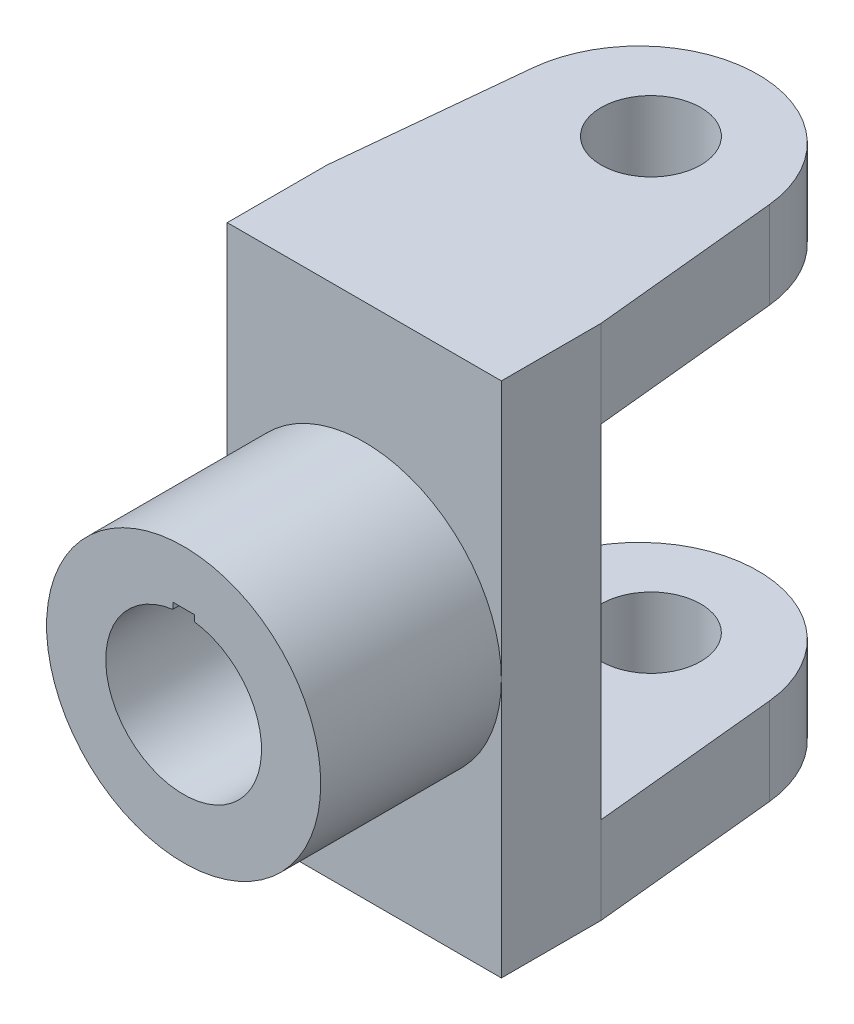
ISO-10303-21;
HEADER;
FILE_DESCRIPTION(('STEP AP214'),'2;1');
FILE_NAME('part.step','',(''),(''),'','','');
FILE_SCHEMA(('AUTOMOTIVE_DESIGN { 1 0 10303 214 1 1 1 1 }'));
ENDSEC;
DATA;
#1=APPLICATION_CONTEXT('core data for automotive mechanical design processes');
#2=APPLICATION_PROTOCOL_DEFINITION('international standard','automotive_design',2000,#1);
#3=PRODUCT_CONTEXT('',#1,'mechanical');
#4=PRODUCT('Part','Part','',(#3));
#5=PRODUCT_RELATED_PRODUCT_CATEGORY('part','',(#4));
#6=PRODUCT_DEFINITION_FORMATION('','',#4);
#7=PRODUCT_DEFINITION_CONTEXT('part definition',#1,'design');
#8=PRODUCT_DEFINITION('design','',#6,#7);
#9=PRODUCT_DEFINITION_SHAPE('','',#8);
#10=(LENGTH_UNIT() NAMED_UNIT(*) SI_UNIT(.MILLI.,.METRE.));
#11=(NAMED_UNIT(*) PLANE_ANGLE_UNIT() SI_UNIT($,.RADIAN.));
#12=(NAMED_UNIT(*) SI_UNIT($,.STERADIAN.) SOLID_ANGLE_UNIT());
#13=UNCERTAINTY_MEASURE_WITH_UNIT(LENGTH_MEASURE(1.E-05),#10,'distance_accuracy_value','');
#14=(GEOMETRIC_REPRESENTATION_CONTEXT(3) GLOBAL_UNCERTAINTY_ASSIGNED_CONTEXT((#13)) GLOBAL_UNIT_ASSIGNED_CONTEXT((#10,
#11,#12)) REPRESENTATION_CONTEXT('',''));
#15=CARTESIAN_POINT('',(0.,0.,0.));
#16=DIRECTION('',(0.,0.,1.));
#17=DIRECTION('',(1.,0.,0.));
#18=AXIS2_PLACEMENT_3D('',#15,#16,#17);
#19=CARTESIAN_POINT('',(0.,166.,0.));
#20=DIRECTION('',(0.,0.,-1.));
#21=DIRECTION('',(-1.,0.,0.));
#22=AXIS2_PLACEMENT_3D('',#19,#20,#21);
#23=PLANE('',#22);
#24=CARTESIAN_POINT('',(44.,83.,0.));
#25=DIRECTION('',(0.,0.,1.));
#26=DIRECTION('',(1.,0.,0.));
#27=AXIS2_PLACEMENT_3D('',#24,#25,#26);
#28=CIRCLE('',#27,44.);
#29=CARTESIAN_POINT('',(88.,83.,0.));
#30=VERTEX_POINT('',#29);
#31=CARTESIAN_POINT('',(0.,83.,0.));
#32=VERTEX_POINT('',#31);
#33=EDGE_CURVE('E52',#30,#32,#28,.T.);
#34=ORIENTED_EDGE('',*,*,#33,.F.);
#35=DIRECTION('',(0.,-1.,0.));
#36=VECTOR('',#35,1.);
#37=CARTESIAN_POINT('',(88.,166.,0.));
#38=LINE('',#37,#36);
#39=CARTESIAN_POINT('',(88.,166.,0.));
#40=VERTEX_POINT('',#39);
#41=EDGE_CURVE('E260',#40,#30,#38,.T.);
#42=ORIENTED_EDGE('',*,*,#41,.F.);
#43=DIRECTION('',(1.,0.,0.));
#44=VECTOR('',#43,1.);
#45=CARTESIAN_POINT('',(0.,166.,0.));
#46=LINE('',#45,#44);
#47=CARTESIAN_POINT('',(0.,166.,0.));
#48=VERTEX_POINT('',#47);
#49=EDGE_CURVE('E235',#48,#40,#46,.T.);
#50=ORIENTED_EDGE('',*,*,#49,.F.);
#51=DIRECTION('',(0.,-1.,0.));
#52=VECTOR('',#51,1.);
#53=CARTESIAN_POINT('',(0.,166.,0.));
#54=LINE('',#53,#52);
#55=EDGE_CURVE('E263',#48,#32,#54,.T.);
#56=ORIENTED_EDGE('',*,*,#55,.T.);
#57=EDGE_LOOP('',(#34,#42,#50,#56));
#58=FACE_BOUND('',#57,.T.);
#59=ADVANCED_FACE('F41',(#58),#23,.F.);
#60=EDGE_CURVE('E11',#32,#30,#28,.T.);
#61=ORIENTED_EDGE('',*,*,#60,.F.);
#62=CARTESIAN_POINT('',(0.,0.,0.));
#63=VERTEX_POINT('',#62);
#64=EDGE_CURVE('E262',#32,#63,#54,.T.);
#65=ORIENTED_EDGE('',*,*,#64,.T.);
#66=DIRECTION('',(1.,0.,0.));
#67=VECTOR('',#66,1.);
#68=CARTESIAN_POINT('',(0.,0.,0.));
#69=LINE('',#68,#67);
#70=CARTESIAN_POINT('',(88.,0.,0.));
#71=VERTEX_POINT('',#70);
#72=EDGE_CURVE('E255',#63,#71,#69,.T.);
#73=ORIENTED_EDGE('',*,*,#72,.T.);
#74=EDGE_CURVE('E240',#30,#71,#38,.T.);
#75=ORIENTED_EDGE('',*,*,#74,.F.);
#76=EDGE_LOOP('',(#61,#65,#73,#75));
#77=FACE_BOUND('',#76,.T.);
#78=ADVANCED_FACE('F315',(#77),#23,.F.);
#79=CARTESIAN_POINT('',(90.2970297029703,166.,-9.02970297029701));
#80=DIRECTION('',(-0.995037190209989,0.,0.0995037190209987));
#81=DIRECTION('',(0.0995037190209988,0.,0.995037190209989));
#82=AXIS2_PLACEMENT_3D('',#79,#80,#81);
#83=PLANE('',#82);
#84=DIRECTION('',(-0.0995037190209988,0.,-0.995037190209989));
#85=VECTOR('',#84,1.);
#86=CARTESIAN_POINT('',(90.2970297029703,28.,-9.02970297029701));
#87=LINE('',#86,#85);
#88=CARTESIAN_POINT('',(88.,28.,-32.));
#89=VERTEX_POINT('',#88);
#90=CARTESIAN_POINT('',(82.,28.,-92.));
#91=VERTEX_POINT('',#90);
#92=EDGE_CURVE('E214',#89,#91,#87,.T.);
#93=ORIENTED_EDGE('',*,*,#92,.F.);
#94=DIRECTION('',(0.,-1.,0.));
#95=VECTOR('',#94,1.);
#96=CARTESIAN_POINT('',(88.,166.,-32.));
#97=LINE('',#96,#95);
#98=CARTESIAN_POINT('',(88.,0.,-32.));
#99=VERTEX_POINT('',#98);
#100=EDGE_CURVE('E278',#89,#99,#97,.T.);
#101=ORIENTED_EDGE('',*,*,#100,.T.);
#102=DIRECTION('',(-0.0995037190209988,0.,-0.995037190209989));
#103=VECTOR('',#102,1.);
#104=CARTESIAN_POINT('',(90.2970297029703,0.,-9.02970297029701));
#105=LINE('',#104,#103);
#106=CARTESIAN_POINT('',(82.,0.,-92.));
#107=VERTEX_POINT('',#106);
#108=EDGE_CURVE('E243',#99,#107,#105,.T.);
#109=ORIENTED_EDGE('',*,*,#108,.T.);
#110=DIRECTION('',(0.,-1.,0.));
#111=VECTOR('',#110,1.);
#112=CARTESIAN_POINT('',(82.,166.,-92.));
#113=LINE('',#112,#111);
#114=EDGE_CURVE('E274',#91,#107,#113,.T.);
#115=ORIENTED_EDGE('',*,*,#114,.F.);
#116=EDGE_LOOP('',(#93,#101,#109,#115));
#117=FACE_BOUND('',#116,.T.);
#118=ADVANCED_FACE('F336',(#117),#83,.F.);
#119=DIRECTION('',(0.0995037190209988,0.,0.995037190209989));
#120=VECTOR('',#119,1.);
#121=CARTESIAN_POINT('',(90.2970297029703,138.,-9.02970297029701));
#122=LINE('',#121,#120);
#123=CARTESIAN_POINT('',(82.,138.,-92.));
#124=VERTEX_POINT('',#123);
#125=CARTESIAN_POINT('',(88.,138.,-32.));
#126=VERTEX_POINT('',#125);
#127=EDGE_CURVE('E207',#124,#126,#122,.T.);
#128=ORIENTED_EDGE('',*,*,#127,.F.);
#129=CARTESIAN_POINT('',(82.,166.,-92.));
#130=VERTEX_POINT('',#129);
#131=EDGE_CURVE('E275',#130,#124,#113,.T.);
#132=ORIENTED_EDGE('',*,*,#131,.F.);
#133=DIRECTION('',(-0.0995037190209988,0.,-0.995037190209989));
#134=VECTOR('',#133,1.);
#135=CARTESIAN_POINT('',(90.2970297029703,166.,-9.02970297029701));
#136=LINE('',#135,#134);
#137=CARTESIAN_POINT('',(88.,166.,-32.));
#138=VERTEX_POINT('',#137);
#139=EDGE_CURVE('E223',#138,#130,#136,.T.);
#140=ORIENTED_EDGE('',*,*,#139,.F.);
#141=EDGE_CURVE('E50',#138,#126,#97,.T.);
#142=ORIENTED_EDGE('',*,*,#141,.T.);
#143=EDGE_LOOP('',(#128,#132,#140,#142));
#144=FACE_BOUND('',#143,.T.);
#145=ADVANCED_FACE('F304',(#144),#83,.F.);
#146=CARTESIAN_POINT('',(44.,166.,-88.2));
#147=DIRECTION('',(0.,-1.,0.));
#148=DIRECTION('',(0.,0.,-1.));
#149=AXIS2_PLACEMENT_3D('',#146,#147,#148);
#150=CYLINDRICAL_SURFACE('',#149,38.1895273602594);
#151=CARTESIAN_POINT('',(44.,28.,-88.2));
#152=DIRECTION('',(0.,1.,0.));
#153=DIRECTION('',(0.,0.,1.));
#154=AXIS2_PLACEMENT_3D('',#151,#152,#153);
#155=CIRCLE('',#154,38.1895273602594);
#156=CARTESIAN_POINT('',(6.00000000000001,28.,-92.));
#157=VERTEX_POINT('',#156);
#158=EDGE_CURVE('E212',#157,#91,#155,.F.);
#159=ORIENTED_EDGE('',*,*,#158,.T.);
#160=ORIENTED_EDGE('',*,*,#114,.T.);
#161=CARTESIAN_POINT('',(44.,0.,-88.2));
#162=DIRECTION('',(0.,1.,0.));
#163=DIRECTION('',(0.,0.,1.));
#164=AXIS2_PLACEMENT_3D('',#161,#162,#163);
#165=CIRCLE('',#164,38.1895273602594);
#166=CARTESIAN_POINT('',(6.00000000000001,0.,-92.));
#167=VERTEX_POINT('',#166);
#168=EDGE_CURVE('E246',#167,#107,#165,.F.);
#169=ORIENTED_EDGE('',*,*,#168,.F.);
#170=DIRECTION('',(0.,-1.,0.));
#171=VECTOR('',#170,1.);
#172=CARTESIAN_POINT('',(6.00000000000001,166.,-92.));
#173=LINE('',#172,#171);
#174=EDGE_CURVE('E270',#157,#167,#173,.T.);
#175=ORIENTED_EDGE('',*,*,#174,.F.);
#176=EDGE_LOOP('',(#159,#160,#169,#175));
#177=FACE_BOUND('',#176,.T.);
#178=ADVANCED_FACE('F426',(#177),#150,.T.);
#179=CARTESIAN_POINT('',(44.,138.,-88.2));
#180=DIRECTION('',(0.,-1.,0.));
#181=DIRECTION('',(0.,0.,-1.));
#182=AXIS2_PLACEMENT_3D('',#179,#180,#181);
#183=CIRCLE('',#182,38.1895273602594);
#184=CARTESIAN_POINT('',(6.00000000000001,138.,-92.));
#185=VERTEX_POINT('',#184);
#186=EDGE_CURVE('E205',#124,#185,#183,.F.);
#187=ORIENTED_EDGE('',*,*,#186,.T.);
#188=CARTESIAN_POINT('',(6.00000000000001,166.,-92.));
#189=VERTEX_POINT('',#188);
#190=EDGE_CURVE('E271',#189,#185,#173,.T.);
#191=ORIENTED_EDGE('',*,*,#190,.F.);
#192=CARTESIAN_POINT('',(44.,166.,-88.2));
#193=DIRECTION('',(0.,1.,0.));
#194=DIRECTION('',(0.,0.,1.));
#195=AXIS2_PLACEMENT_3D('',#192,#193,#194);
#196=CIRCLE('',#195,38.1895273602594);
#197=EDGE_CURVE('E226',#189,#130,#196,.F.);
#198=ORIENTED_EDGE('',*,*,#197,.T.);
#199=ORIENTED_EDGE('',*,*,#131,.T.);
#200=EDGE_LOOP('',(#187,#191,#198,#199));
#201=FACE_BOUND('',#200,.T.);
#202=ADVANCED_FACE('F433',(#201),#150,.T.);
#203=CARTESIAN_POINT('',(-3.16831683168316,166.,-0.316831683168316));
#204=DIRECTION('',(-0.995037190209989,0.,-0.0995037190209989));
#205=DIRECTION('',(-0.0995037190209989,0.,0.995037190209989));
#206=AXIS2_PLACEMENT_3D('',#203,#204,#205);
#207=PLANE('',#206);
#208=DIRECTION('',(0.,-1.,0.));
#209=VECTOR('',#208,1.);
#210=CARTESIAN_POINT('',(0.,166.,-32.));
#211=LINE('',#210,#209);
#212=CARTESIAN_POINT('',(0.,28.,-32.));
#213=VERTEX_POINT('',#212);
#214=CARTESIAN_POINT('',(0.,0.,-32.));
#215=VERTEX_POINT('',#214);
#216=EDGE_CURVE('E266',#213,#215,#211,.T.);
#217=ORIENTED_EDGE('',*,*,#216,.F.);
#218=DIRECTION('',(0.0995037190209989,0.,-0.995037190209989));
#219=VECTOR('',#218,1.);
#220=CARTESIAN_POINT('',(-3.16831683168316,28.,-0.316831683168316));
#221=LINE('',#220,#219);
#222=EDGE_CURVE('E209',#213,#157,#221,.T.);
#223=ORIENTED_EDGE('',*,*,#222,.T.);
#224=ORIENTED_EDGE('',*,*,#174,.T.);
#225=DIRECTION('',(0.0995037190209989,0.,-0.995037190209989));
#226=VECTOR('',#225,1.);
#227=CARTESIAN_POINT('',(-3.16831683168316,0.,-0.316831683168316));
#228=LINE('',#227,#226);
#229=EDGE_CURVE('E249',#215,#167,#228,.T.);
#230=ORIENTED_EDGE('',*,*,#229,.F.);
#231=EDGE_LOOP('',(#217,#223,#224,#230));
#232=FACE_BOUND('',#231,.T.);
#233=ADVANCED_FACE('F443',(#232),#207,.T.);
#234=ORIENTED_EDGE('',*,*,#190,.T.);
#235=DIRECTION('',(-0.0995037190209989,0.,0.995037190209989));
#236=VECTOR('',#235,1.);
#237=CARTESIAN_POINT('',(-3.16831683168316,138.,-0.316831683168316));
#238=LINE('',#237,#236);
#239=CARTESIAN_POINT('',(0.,138.,-32.));
#240=VERTEX_POINT('',#239);
#241=EDGE_CURVE('E202',#185,#240,#238,.T.);
#242=ORIENTED_EDGE('',*,*,#241,.T.);
#243=CARTESIAN_POINT('',(0.,166.,-32.));
#244=VERTEX_POINT('',#243);
#245=EDGE_CURVE('E267',#244,#240,#211,.T.);
#246=ORIENTED_EDGE('',*,*,#245,.F.);
#247=DIRECTION('',(0.0995037190209989,0.,-0.995037190209989));
#248=VECTOR('',#247,1.);
#249=CARTESIAN_POINT('',(-3.16831683168316,166.,-0.316831683168316));
#250=LINE('',#249,#248);
#251=EDGE_CURVE('E229',#244,#189,#250,.T.);
#252=ORIENTED_EDGE('',*,*,#251,.T.);
#253=EDGE_LOOP('',(#234,#242,#246,#252));
#254=FACE_BOUND('',#253,.T.);
#255=ADVANCED_FACE('F451',(#254),#207,.T.);
#256=CARTESIAN_POINT('',(44.,166.,-92.));
#257=DIRECTION('',(0.,-1.,0.));
#258=DIRECTION('',(0.,0.,-1.));
#259=AXIS2_PLACEMENT_3D('',#256,#257,#258);
#260=CYLINDRICAL_SURFACE('',#259,16.);
#261=CARTESIAN_POINT('',(44.,0.,-92.));
#262=DIRECTION('',(0.,1.,0.));
#263=DIRECTION('',(0.,0.,1.));
#264=AXIS2_PLACEMENT_3D('',#261,#262,#263);
#265=CIRCLE('',#264,16.);
#266=CARTESIAN_POINT('',(44.,0.,-76.));
#267=VERTEX_POINT('',#266);
#268=EDGE_CURVE('E224',#267,#267,#265,.T.);
#269=ORIENTED_EDGE('',*,*,#268,.F.);
#270=EDGE_LOOP('',(#269));
#271=FACE_BOUND('',#270,.T.);
#272=CARTESIAN_POINT('',(44.,28.,-92.));
#273=DIRECTION('',(0.,1.,0.));
#274=DIRECTION('',(0.,0.,1.));
#275=AXIS2_PLACEMENT_3D('',#272,#273,#274);
#276=CIRCLE('',#275,16.);
#277=CARTESIAN_POINT('',(44.,28.,-76.));
#278=VERTEX_POINT('',#277);
#279=EDGE_CURVE('E45',#278,#278,#276,.T.);
#280=ORIENTED_EDGE('',*,*,#279,.T.);
#281=EDGE_LOOP('',(#280));
#282=FACE_BOUND('',#281,.T.);
#283=ADVANCED_FACE('F460',(#271,#282),#260,.F.);
#284=CARTESIAN_POINT('',(44.,166.,-92.));
#285=DIRECTION('',(0.,1.,0.));
#286=DIRECTION('',(0.,0.,1.));
#287=AXIS2_PLACEMENT_3D('',#284,#285,#286);
#288=CIRCLE('',#287,16.);
#289=CARTESIAN_POINT('',(44.,166.,-76.));
#290=VERTEX_POINT('',#289);
#291=EDGE_CURVE('E237',#290,#290,#288,.T.);
#292=ORIENTED_EDGE('',*,*,#291,.T.);
#293=EDGE_LOOP('',(#292));
#294=FACE_BOUND('',#293,.T.);
#295=CARTESIAN_POINT('',(44.,138.,-92.));
#296=DIRECTION('',(0.,-1.,0.));
#297=DIRECTION('',(0.,0.,-1.));
#298=AXIS2_PLACEMENT_3D('',#295,#296,#297);
#299=CIRCLE('',#298,16.);
#300=CARTESIAN_POINT('',(44.,138.,-108.));
#301=VERTEX_POINT('',#300);
#302=EDGE_CURVE('E201',#301,#301,#299,.T.);
#303=ORIENTED_EDGE('',*,*,#302,.T.);
#304=EDGE_LOOP('',(#303));
#305=FACE_BOUND('',#304,.T.);
#306=ADVANCED_FACE('F283',(#294,#305),#260,.F.);
#307=CARTESIAN_POINT('',(88.,166.,0.));
#308=DIRECTION('',(1.,0.,0.));
#309=DIRECTION('',(0.,0.,-1.));
#310=AXIS2_PLACEMENT_3D('',#307,#308,#309);
#311=PLANE('',#310);
#312=DIRECTION('',(0.,0.,1.));
#313=VECTOR('',#312,1.);
#314=CARTESIAN_POINT('',(88.,0.,0.));
#315=LINE('',#314,#313);
#316=EDGE_CURVE('E219',#99,#71,#315,.T.);
#317=ORIENTED_EDGE('',*,*,#316,.F.);
#318=ORIENTED_EDGE('',*,*,#100,.F.);
#319=DIRECTION('',(0.,-1.,0.));
#320=VECTOR('',#319,1.);
#321=CARTESIAN_POINT('',(88.,166.,-32.));
#322=LINE('',#321,#320);
#323=EDGE_CURVE('E217',#126,#89,#322,.T.);
#324=ORIENTED_EDGE('',*,*,#323,.F.);
#325=ORIENTED_EDGE('',*,*,#141,.F.);
#326=DIRECTION('',(0.,0.,1.));
#327=VECTOR('',#326,1.);
#328=CARTESIAN_POINT('',(88.,166.,0.));
#329=LINE('',#328,#327);
#330=EDGE_CURVE('E220',#138,#40,#329,.T.);
#331=ORIENTED_EDGE('',*,*,#330,.T.);
#332=ORIENTED_EDGE('',*,*,#41,.T.);
#333=ORIENTED_EDGE('',*,*,#74,.T.);
#334=EDGE_LOOP('',(#317,#318,#324,#325,#331,#332,#333));
#335=FACE_BOUND('',#334,.T.);
#336=ADVANCED_FACE('F43',(#335),#311,.T.);
#337=CARTESIAN_POINT('',(0.,166.,0.));
#338=DIRECTION('',(-1.,0.,0.));
#339=DIRECTION('',(0.,0.,1.));
#340=AXIS2_PLACEMENT_3D('',#337,#338,#339);
#341=PLANE('',#340);
#342=DIRECTION('',(0.,0.,-1.));
#343=VECTOR('',#342,1.);
#344=CARTESIAN_POINT('',(0.,0.,0.));
#345=LINE('',#344,#343);
#346=EDGE_CURVE('E252',#63,#215,#345,.T.);
#347=ORIENTED_EDGE('',*,*,#346,.F.);
#348=ORIENTED_EDGE('',*,*,#64,.F.);
#349=ORIENTED_EDGE('',*,*,#55,.F.);
#350=DIRECTION('',(0.,0.,-1.));
#351=VECTOR('',#350,1.);
#352=CARTESIAN_POINT('',(0.,166.,0.));
#353=LINE('',#352,#351);
#354=EDGE_CURVE('E232',#48,#244,#353,.T.);
#355=ORIENTED_EDGE('',*,*,#354,.T.);
#356=ORIENTED_EDGE('',*,*,#245,.T.);
#357=DIRECTION('',(0.,-1.,0.));
#358=VECTOR('',#357,1.);
#359=CARTESIAN_POINT('',(0.,138.,-32.));
#360=LINE('',#359,#358);
#361=EDGE_CURVE('E192',#240,#213,#360,.T.);
#362=ORIENTED_EDGE('',*,*,#361,.T.);
#363=ORIENTED_EDGE('',*,*,#216,.T.);
#364=EDGE_LOOP('',(#347,#348,#349,#355,#356,#362,#363));
#365=FACE_BOUND('',#364,.T.);
#366=ADVANCED_FACE('F491',(#365),#341,.T.);
#367=CARTESIAN_POINT('',(0.,166.,0.));
#368=DIRECTION('',(0.,1.,0.));
#369=DIRECTION('',(0.,0.,1.));
#370=AXIS2_PLACEMENT_3D('',#367,#368,#369);
#371=PLANE('',#370);
#372=ORIENTED_EDGE('',*,*,#330,.F.);
#373=ORIENTED_EDGE('',*,*,#139,.T.);
#374=ORIENTED_EDGE('',*,*,#197,.F.);
#375=ORIENTED_EDGE('',*,*,#251,.F.);
#376=ORIENTED_EDGE('',*,*,#354,.F.);
#377=ORIENTED_EDGE('',*,*,#49,.T.);
#378=EDGE_LOOP('',(#372,#373,#374,#375,#376,#377));
#379=FACE_BOUND('',#378,.T.);
#380=ORIENTED_EDGE('',*,*,#291,.F.);
#381=EDGE_LOOP('',(#380));
#382=FACE_BOUND('',#381,.T.);
#383=ADVANCED_FACE('F308',(#379,#382),#371,.T.);
#384=CARTESIAN_POINT('',(0.,0.,0.));
#385=DIRECTION('',(0.,1.,0.));
#386=DIRECTION('',(0.,0.,1.));
#387=AXIS2_PLACEMENT_3D('',#384,#385,#386);
#388=PLANE('',#387);
#389=ORIENTED_EDGE('',*,*,#316,.T.);
#390=ORIENTED_EDGE('',*,*,#72,.F.);
#391=ORIENTED_EDGE('',*,*,#346,.T.);
#392=ORIENTED_EDGE('',*,*,#229,.T.);
#393=ORIENTED_EDGE('',*,*,#168,.T.);
#394=ORIENTED_EDGE('',*,*,#108,.F.);
#395=EDGE_LOOP('',(#389,#390,#391,#392,#393,#394));
#396=FACE_BOUND('',#395,.T.);
#397=ORIENTED_EDGE('',*,*,#268,.T.);
#398=EDGE_LOOP('',(#397));
#399=FACE_BOUND('',#398,.T.);
#400=ADVANCED_FACE('F409',(#396,#399),#388,.F.);
#401=CARTESIAN_POINT('',(166.,138.,-32.));
#402=DIRECTION('',(0.,0.,-1.));
#403=DIRECTION('',(-1.,0.,0.));
#404=AXIS2_PLACEMENT_3D('',#401,#402,#403);
#405=PLANE('',#404);
#406=ORIENTED_EDGE('',*,*,#323,.T.);
#407=DIRECTION('',(-1.,0.,0.));
#408=VECTOR('',#407,1.);
#409=CARTESIAN_POINT('',(166.,28.,-32.));
#410=LINE('',#409,#408);
#411=EDGE_CURVE('E199',#89,#213,#410,.T.);
#412=ORIENTED_EDGE('',*,*,#411,.T.);
#413=ORIENTED_EDGE('',*,*,#361,.F.);
#414=DIRECTION('',(-1.,0.,0.));
#415=VECTOR('',#414,1.);
#416=CARTESIAN_POINT('',(166.,138.,-32.));
#417=LINE('',#416,#415);
#418=EDGE_CURVE('E197',#126,#240,#417,.T.);
#419=ORIENTED_EDGE('',*,*,#418,.F.);
#420=EDGE_LOOP('',(#406,#412,#413,#419));
#421=FACE_BOUND('',#420,.T.);
#422=ADVANCED_FACE('F298',(#421),#405,.T.);
#423=CARTESIAN_POINT('',(166.,28.,-32.));
#424=DIRECTION('',(0.,1.,0.));
#425=DIRECTION('',(0.,0.,1.));
#426=AXIS2_PLACEMENT_3D('',#423,#424,#425);
#427=PLANE('',#426);
#428=ORIENTED_EDGE('',*,*,#279,.F.);
#429=EDGE_LOOP('',(#428));
#430=FACE_BOUND('',#429,.T.);
#431=ORIENTED_EDGE('',*,*,#92,.T.);
#432=ORIENTED_EDGE('',*,*,#158,.F.);
#433=ORIENTED_EDGE('',*,*,#222,.F.);
#434=ORIENTED_EDGE('',*,*,#411,.F.);
#435=EDGE_LOOP('',(#431,#432,#433,#434));
#436=FACE_BOUND('',#435,.T.);
#437=ADVANCED_FACE('F288',(#430,#436),#427,.T.);
#438=CARTESIAN_POINT('',(166.,138.,-32.));
#439=DIRECTION('',(0.,-1.,0.));
#440=DIRECTION('',(0.,0.,-1.));
#441=AXIS2_PLACEMENT_3D('',#438,#439,#440);
#442=PLANE('',#441);
#443=ORIENTED_EDGE('',*,*,#302,.F.);
#444=EDGE_LOOP('',(#443));
#445=FACE_BOUND('',#444,.T.);
#446=ORIENTED_EDGE('',*,*,#127,.T.);
#447=ORIENTED_EDGE('',*,*,#418,.T.);
#448=ORIENTED_EDGE('',*,*,#241,.F.);
#449=ORIENTED_EDGE('',*,*,#186,.F.);
#450=EDGE_LOOP('',(#446,#447,#448,#449));
#451=FACE_BOUND('',#450,.T.);
#452=ADVANCED_FACE('F285',(#445,#451),#442,.T.);
#453=CARTESIAN_POINT('',(44.,83.,58.));
#454=DIRECTION('',(0.,0.,1.));
#455=DIRECTION('',(1.,0.,0.));
#456=AXIS2_PLACEMENT_3D('',#453,#454,#455);
#457=PLANE('',#456);
#458=CARTESIAN_POINT('',(44.,83.,58.));
#459=DIRECTION('',(0.,0.,1.));
#460=DIRECTION('',(1.,0.,0.));
#461=AXIS2_PLACEMENT_3D('',#458,#459,#460);
#462=CIRCLE('',#461,44.);
#463=CARTESIAN_POINT('',(88.,83.,58.));
#464=VERTEX_POINT('',#463);
#465=EDGE_CURVE('E190',#464,#464,#462,.T.);
#466=ORIENTED_EDGE('',*,*,#465,.T.);
#467=EDGE_LOOP('',(#466));
#468=FACE_BOUND('',#467,.T.);
#469=DIRECTION('',(0.,1.,0.));
#470=VECTOR('',#469,1.);
#471=CARTESIAN_POINT('',(47.5085855301898,109.755,58.));
#472=LINE('',#471,#470);
#473=CARTESIAN_POINT('',(47.5085855301898,107.752572140635,58.));
#474=VERTEX_POINT('',#473);
#475=CARTESIAN_POINT('',(47.5085855301898,109.755,58.));
#476=VERTEX_POINT('',#475);
#477=EDGE_CURVE('E159',#474,#476,#472,.T.);
#478=ORIENTED_EDGE('',*,*,#477,.F.);
#479=CARTESIAN_POINT('',(44.,83.,58.));
#480=DIRECTION('',(0.,0.,1.));
#481=DIRECTION('',(1.,0.,0.));
#482=AXIS2_PLACEMENT_3D('',#479,#480,#481);
#483=CIRCLE('',#482,25.);
#484=CARTESIAN_POINT('',(40.5085855301898,107.755,58.));
#485=VERTEX_POINT('',#484);
#486=EDGE_CURVE('E151',#485,#474,#483,.T.);
#487=ORIENTED_EDGE('',*,*,#486,.F.);
#488=DIRECTION('',(0.,-1.,0.));
#489=VECTOR('',#488,1.);
#490=CARTESIAN_POINT('',(40.5085855301898,107.755,58.));
#491=LINE('',#490,#489);
#492=CARTESIAN_POINT('',(40.5085855301898,109.755,58.));
#493=VERTEX_POINT('',#492);
#494=EDGE_CURVE('E174',#493,#485,#491,.T.);
#495=ORIENTED_EDGE('',*,*,#494,.F.);
#496=DIRECTION('',(-1.,0.,0.));
#497=VECTOR('',#496,1.);
#498=CARTESIAN_POINT('',(40.5085855301898,109.755,58.));
#499=LINE('',#498,#497);
#500=EDGE_CURVE('E172',#476,#493,#499,.T.);
#501=ORIENTED_EDGE('',*,*,#500,.F.);
#502=EDGE_LOOP('',(#478,#487,#495,#501));
#503=FACE_BOUND('',#502,.T.);
#504=ADVANCED_FACE('F170',(#468,#503),#457,.T.);
#505=CARTESIAN_POINT('',(44.,83.,58.));
#506=DIRECTION('',(0.,0.,-1.));
#507=DIRECTION('',(-1.,0.,0.));
#508=AXIS2_PLACEMENT_3D('',#505,#506,#507);
#509=CYLINDRICAL_SURFACE('',#508,44.);
#510=ORIENTED_EDGE('',*,*,#465,.F.);
#511=EDGE_LOOP('',(#510));
#512=FACE_BOUND('',#511,.T.);
#513=ORIENTED_EDGE('',*,*,#33,.T.);
#514=ORIENTED_EDGE('',*,*,#60,.T.);
#515=EDGE_LOOP('',(#513,#514));
#516=FACE_BOUND('',#515,.T.);
#517=ADVANCED_FACE('F318',(#512,#516),#509,.T.);
#518=CARTESIAN_POINT('',(44.,83.,58.));
#519=DIRECTION('',(0.,0.,-1.));
#520=DIRECTION('',(-1.,0.,0.));
#521=AXIS2_PLACEMENT_3D('',#518,#519,#520);
#522=CYLINDRICAL_SURFACE('',#521,25.);
#523=CARTESIAN_POINT('',(44.,83.,0.));
#524=DIRECTION('',(0.,0.,1.));
#525=DIRECTION('',(1.,0.,0.));
#526=AXIS2_PLACEMENT_3D('',#523,#524,#525);
#527=CIRCLE('',#526,25.);
#528=CARTESIAN_POINT('',(40.5085855301898,107.755,0.));
#529=VERTEX_POINT('',#528);
#530=CARTESIAN_POINT('',(47.5085855301898,107.752572140635,0.));
#531=VERTEX_POINT('',#530);
#532=EDGE_CURVE('E178',#529,#531,#527,.T.);
#533=ORIENTED_EDGE('',*,*,#532,.F.);
#534=DIRECTION('',(0.,0.,-1.));
#535=VECTOR('',#534,1.);
#536=CARTESIAN_POINT('',(40.5085855301898,107.755,58.));
#537=LINE('',#536,#535);
#538=EDGE_CURVE('E59',#485,#529,#537,.T.);
#539=ORIENTED_EDGE('',*,*,#538,.F.);
#540=ORIENTED_EDGE('',*,*,#486,.T.);
#541=DIRECTION('',(0.,0.,-1.));
#542=VECTOR('',#541,1.);
#543=CARTESIAN_POINT('',(47.5085855301898,107.752572140635,58.));
#544=LINE('',#543,#542);
#545=EDGE_CURVE('E154',#474,#531,#544,.T.);
#546=ORIENTED_EDGE('',*,*,#545,.T.);
#547=EDGE_LOOP('',(#533,#539,#540,#546));
#548=FACE_BOUND('',#547,.T.);
#549=ADVANCED_FACE('F153',(#548),#522,.F.);
#550=CARTESIAN_POINT('',(47.5085855301898,109.755,58.));
#551=DIRECTION('',(-1.,0.,0.));
#552=DIRECTION('',(0.,0.,1.));
#553=AXIS2_PLACEMENT_3D('',#550,#551,#552);
#554=PLANE('',#553);
#555=DIRECTION('',(0.,1.,0.));
#556=VECTOR('',#555,1.);
#557=CARTESIAN_POINT('',(47.5085855301898,109.755,0.));
#558=LINE('',#557,#556);
#559=CARTESIAN_POINT('',(47.5085855301898,109.755,0.));
#560=VERTEX_POINT('',#559);
#561=EDGE_CURVE('E166',#531,#560,#558,.T.);
#562=ORIENTED_EDGE('',*,*,#561,.F.);
#563=ORIENTED_EDGE('',*,*,#545,.F.);
#564=ORIENTED_EDGE('',*,*,#477,.T.);
#565=DIRECTION('',(0.,0.,-1.));
#566=VECTOR('',#565,1.);
#567=CARTESIAN_POINT('',(47.5085855301898,109.755,58.));
#568=LINE('',#567,#566);
#569=EDGE_CURVE('E167',#476,#560,#568,.T.);
#570=ORIENTED_EDGE('',*,*,#569,.T.);
#571=EDGE_LOOP('',(#562,#563,#564,#570));
#572=FACE_BOUND('',#571,.T.);
#573=ADVANCED_FACE('F163',(#572),#554,.T.);
#574=CARTESIAN_POINT('',(40.5085855301898,109.755,58.));
#575=DIRECTION('',(0.,-1.,0.));
#576=DIRECTION('',(0.,0.,-1.));
#577=AXIS2_PLACEMENT_3D('',#574,#575,#576);
#578=PLANE('',#577);
#579=DIRECTION('',(-1.,0.,0.));
#580=VECTOR('',#579,1.);
#581=CARTESIAN_POINT('',(40.5085855301898,109.755,0.));
#582=LINE('',#581,#580);
#583=CARTESIAN_POINT('',(40.5085855301898,109.755,0.));
#584=VERTEX_POINT('',#583);
#585=EDGE_CURVE('E181',#560,#584,#582,.T.);
#586=ORIENTED_EDGE('',*,*,#585,.F.);
#587=ORIENTED_EDGE('',*,*,#569,.F.);
#588=ORIENTED_EDGE('',*,*,#500,.T.);
#589=DIRECTION('',(0.,0.,-1.));
#590=VECTOR('',#589,1.);
#591=CARTESIAN_POINT('',(40.5085855301898,109.755,58.));
#592=LINE('',#591,#590);
#593=EDGE_CURVE('E187',#493,#584,#592,.T.);
#594=ORIENTED_EDGE('',*,*,#593,.T.);
#595=EDGE_LOOP('',(#586,#587,#588,#594));
#596=FACE_BOUND('',#595,.T.);
#597=ADVANCED_FACE('F345',(#596),#578,.T.);
#598=CARTESIAN_POINT('',(40.5085855301898,107.755,58.));
#599=DIRECTION('',(1.,0.,0.));
#600=DIRECTION('',(0.,0.,-1.));
#601=AXIS2_PLACEMENT_3D('',#598,#599,#600);
#602=PLANE('',#601);
#603=DIRECTION('',(0.,-1.,0.));
#604=VECTOR('',#603,1.);
#605=CARTESIAN_POINT('',(40.5085855301898,107.755,0.));
#606=LINE('',#605,#604);
#607=EDGE_CURVE('E160',#584,#529,#606,.T.);
#608=ORIENTED_EDGE('',*,*,#607,.F.);
#609=ORIENTED_EDGE('',*,*,#593,.F.);
#610=ORIENTED_EDGE('',*,*,#494,.T.);
#611=ORIENTED_EDGE('',*,*,#538,.T.);
#612=EDGE_LOOP('',(#608,#609,#610,#611));
#613=FACE_BOUND('',#612,.T.);
#614=ADVANCED_FACE('F340',(#613),#602,.T.);
#615=ORIENTED_EDGE('',*,*,#607,.T.);
#616=ORIENTED_EDGE('',*,*,#532,.T.);
#617=ORIENTED_EDGE('',*,*,#561,.T.);
#618=ORIENTED_EDGE('',*,*,#585,.T.);
#619=EDGE_LOOP('',(#615,#616,#617,#618));
#620=FACE_BOUND('',#619,.T.);
#621=ADVANCED_FACE('F332',(#620),#23,.F.);
#622=CLOSED_SHELL('',(#59,#78,#118,#145,#178,#202,#233,#255,#283,#306,#336,#366,#383,#400,#422,
#437,#452,#504,#517,#549,#573,#597,#614,#621));
#623=MANIFOLD_SOLID_BREP('B2',#622);
#624=ADVANCED_BREP_SHAPE_REPRESENTATION('',(#18,#623),#14);
#625=SHAPE_DEFINITION_REPRESENTATION(#9,#624);
ENDSEC;
END-ISO-10303-21;
